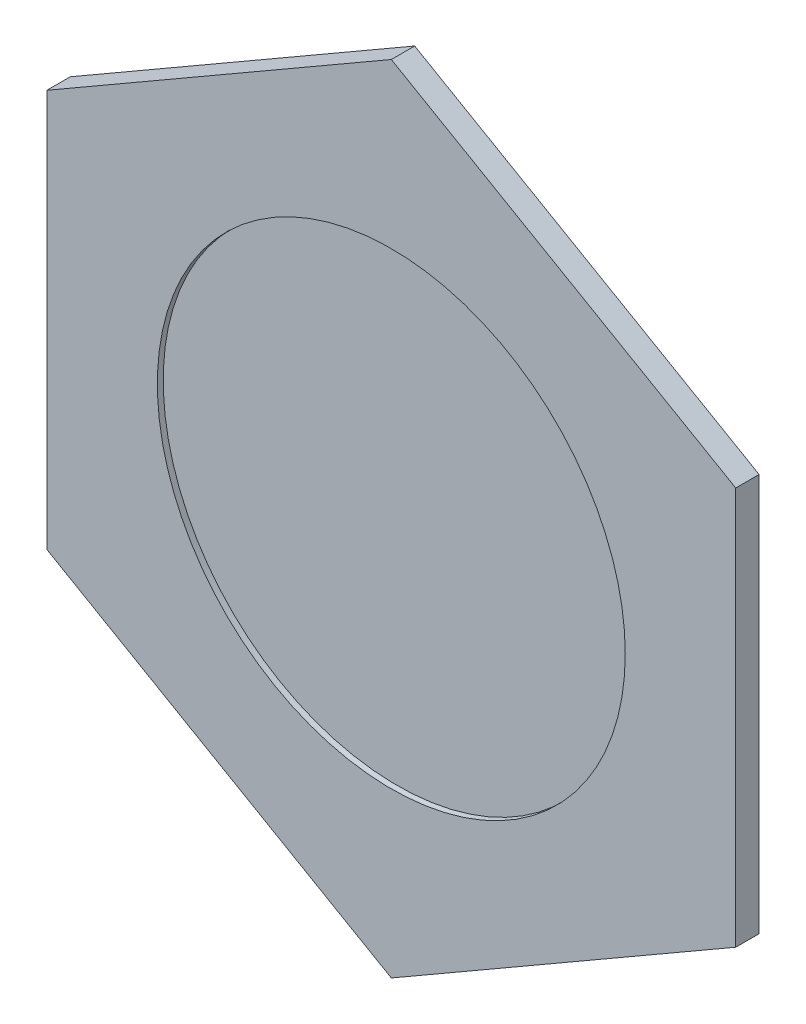
ISO-10303-21;
HEADER;
FILE_DESCRIPTION(('STEP AP214'),'2;1');
FILE_NAME('part.step','',(''),(''),'','','');
FILE_SCHEMA(('AUTOMOTIVE_DESIGN { 1 0 10303 214 1 1 1 1 }'));
ENDSEC;
DATA;
#1=APPLICATION_CONTEXT('core data for automotive mechanical design processes');
#2=APPLICATION_PROTOCOL_DEFINITION('international standard','automotive_design',2000,#1);
#3=PRODUCT_CONTEXT('',#1,'mechanical');
#4=PRODUCT('Part','Part','',(#3));
#5=PRODUCT_RELATED_PRODUCT_CATEGORY('part','',(#4));
#6=PRODUCT_DEFINITION_FORMATION('','',#4);
#7=PRODUCT_DEFINITION_CONTEXT('part definition',#1,'design');
#8=PRODUCT_DEFINITION('design','',#6,#7);
#9=PRODUCT_DEFINITION_SHAPE('','',#8);
#10=(LENGTH_UNIT() NAMED_UNIT(*) SI_UNIT(.MILLI.,.METRE.));
#11=(NAMED_UNIT(*) PLANE_ANGLE_UNIT() SI_UNIT($,.RADIAN.));
#12=(NAMED_UNIT(*) SI_UNIT($,.STERADIAN.) SOLID_ANGLE_UNIT());
#13=UNCERTAINTY_MEASURE_WITH_UNIT(LENGTH_MEASURE(1.E-05),#10,'distance_accuracy_value','');
#14=(GEOMETRIC_REPRESENTATION_CONTEXT(3) GLOBAL_UNCERTAINTY_ASSIGNED_CONTEXT((#13)) GLOBAL_UNIT_ASSIGNED_CONTEXT((#10,
#11,#12)) REPRESENTATION_CONTEXT('',''));
#15=CARTESIAN_POINT('',(0.,0.,0.));
#16=DIRECTION('',(0.,0.,1.));
#17=DIRECTION('',(1.,0.,0.));
#18=AXIS2_PLACEMENT_3D('',#15,#16,#17);
#19=CARTESIAN_POINT('',(0.,68.,4.));
#20=DIRECTION('',(0.5,-0.866025403784439,0.));
#21=DIRECTION('',(0.866025403784439,0.5,0.));
#22=AXIS2_PLACEMENT_3D('',#19,#20,#21);
#23=PLANE('',#22);
#24=DIRECTION('',(-0.866025403784439,-0.5,0.));
#25=VECTOR('',#24,1.);
#26=CARTESIAN_POINT('',(0.,68.,0.));
#27=LINE('',#26,#25);
#28=CARTESIAN_POINT('',(0.,68.,0.));
#29=VERTEX_POINT('',#28);
#30=CARTESIAN_POINT('',(-58.8897274573418,34.,0.));
#31=VERTEX_POINT('',#30);
#32=EDGE_CURVE('E116',#29,#31,#27,.T.);
#33=ORIENTED_EDGE('',*,*,#32,.T.);
#34=DIRECTION('',(0.,0.,-1.));
#35=VECTOR('',#34,1.);
#36=CARTESIAN_POINT('',(-58.8897274573418,34.,4.));
#37=LINE('',#36,#35);
#38=CARTESIAN_POINT('',(-58.8897274573418,34.,4.));
#39=VERTEX_POINT('',#38);
#40=EDGE_CURVE('E11',#39,#31,#37,.T.);
#41=ORIENTED_EDGE('',*,*,#40,.F.);
#42=DIRECTION('',(-0.866025403784439,-0.5,0.));
#43=VECTOR('',#42,1.);
#44=CARTESIAN_POINT('',(0.,68.,4.));
#45=LINE('',#44,#43);
#46=CARTESIAN_POINT('',(0.,68.,4.));
#47=VERTEX_POINT('',#46);
#48=EDGE_CURVE('E127',#47,#39,#45,.T.);
#49=ORIENTED_EDGE('',*,*,#48,.F.);
#50=DIRECTION('',(0.,0.,-1.));
#51=VECTOR('',#50,1.);
#52=CARTESIAN_POINT('',(0.,68.,4.));
#53=LINE('',#52,#51);
#54=EDGE_CURVE('E112',#47,#29,#53,.T.);
#55=ORIENTED_EDGE('',*,*,#54,.T.);
#56=EDGE_LOOP('',(#33,#41,#49,#55));
#57=FACE_BOUND('',#56,.T.);
#58=ADVANCED_FACE('F32',(#57),#23,.F.);
#59=CARTESIAN_POINT('',(-58.8897274573418,34.,4.));
#60=DIRECTION('',(1.,0.,0.));
#61=DIRECTION('',(0.,1.,0.));
#62=AXIS2_PLACEMENT_3D('',#59,#60,#61);
#63=PLANE('',#62);
#64=DIRECTION('',(0.,-1.,0.));
#65=VECTOR('',#64,1.);
#66=CARTESIAN_POINT('',(-58.8897274573418,34.,0.));
#67=LINE('',#66,#65);
#68=CARTESIAN_POINT('',(-58.8897274573418,-34.,0.));
#69=VERTEX_POINT('',#68);
#70=EDGE_CURVE('E119',#31,#69,#67,.T.);
#71=ORIENTED_EDGE('',*,*,#70,.T.);
#72=DIRECTION('',(0.,0.,-1.));
#73=VECTOR('',#72,1.);
#74=CARTESIAN_POINT('',(-58.8897274573418,-34.,4.));
#75=LINE('',#74,#73);
#76=CARTESIAN_POINT('',(-58.8897274573418,-34.,4.));
#77=VERTEX_POINT('',#76);
#78=EDGE_CURVE('E40',#77,#69,#75,.T.);
#79=ORIENTED_EDGE('',*,*,#78,.F.);
#80=DIRECTION('',(0.,-1.,0.));
#81=VECTOR('',#80,1.);
#82=CARTESIAN_POINT('',(-58.8897274573418,34.,4.));
#83=LINE('',#82,#81);
#84=EDGE_CURVE('E85',#39,#77,#83,.T.);
#85=ORIENTED_EDGE('',*,*,#84,.F.);
#86=ORIENTED_EDGE('',*,*,#40,.T.);
#87=EDGE_LOOP('',(#71,#79,#85,#86));
#88=FACE_BOUND('',#87,.T.);
#89=ADVANCED_FACE('F152',(#88),#63,.F.);
#90=CARTESIAN_POINT('',(-58.8897274573418,-34.,4.));
#91=DIRECTION('',(0.5,0.866025403784439,0.));
#92=DIRECTION('',(-0.866025403784439,0.5,0.));
#93=AXIS2_PLACEMENT_3D('',#90,#91,#92);
#94=PLANE('',#93);
#95=DIRECTION('',(0.866025403784439,-0.5,0.));
#96=VECTOR('',#95,1.);
#97=CARTESIAN_POINT('',(-58.8897274573418,-34.,0.));
#98=LINE('',#97,#96);
#99=CARTESIAN_POINT('',(0.,-68.,0.));
#100=VERTEX_POINT('',#99);
#101=EDGE_CURVE('E122',#69,#100,#98,.T.);
#102=ORIENTED_EDGE('',*,*,#101,.T.);
#103=DIRECTION('',(0.,0.,-1.));
#104=VECTOR('',#103,1.);
#105=CARTESIAN_POINT('',(0.,-68.,4.));
#106=LINE('',#105,#104);
#107=CARTESIAN_POINT('',(0.,-68.,4.));
#108=VERTEX_POINT('',#107);
#109=EDGE_CURVE('E107',#108,#100,#106,.T.);
#110=ORIENTED_EDGE('',*,*,#109,.F.);
#111=DIRECTION('',(0.866025403784439,-0.5,0.));
#112=VECTOR('',#111,1.);
#113=CARTESIAN_POINT('',(-58.8897274573418,-34.,4.));
#114=LINE('',#113,#112);
#115=EDGE_CURVE('E98',#77,#108,#114,.T.);
#116=ORIENTED_EDGE('',*,*,#115,.F.);
#117=ORIENTED_EDGE('',*,*,#78,.T.);
#118=EDGE_LOOP('',(#102,#110,#116,#117));
#119=FACE_BOUND('',#118,.T.);
#120=ADVANCED_FACE('F133',(#119),#94,.F.);
#121=CARTESIAN_POINT('',(0.,-68.,4.));
#122=DIRECTION('',(-0.5,0.866025403784439,0.));
#123=DIRECTION('',(-0.866025403784439,-0.5,0.));
#124=AXIS2_PLACEMENT_3D('',#121,#122,#123);
#125=PLANE('',#124);
#126=DIRECTION('',(0.866025403784439,0.5,0.));
#127=VECTOR('',#126,1.);
#128=CARTESIAN_POINT('',(0.,-68.,0.));
#129=LINE('',#128,#127);
#130=CARTESIAN_POINT('',(58.8897274573418,-34.,0.));
#131=VERTEX_POINT('',#130);
#132=EDGE_CURVE('E106',#100,#131,#129,.T.);
#133=ORIENTED_EDGE('',*,*,#132,.T.);
#134=DIRECTION('',(0.,0.,-1.));
#135=VECTOR('',#134,1.);
#136=CARTESIAN_POINT('',(58.8897274573418,-34.,4.));
#137=LINE('',#136,#135);
#138=CARTESIAN_POINT('',(58.8897274573418,-34.,4.));
#139=VERTEX_POINT('',#138);
#140=EDGE_CURVE('E103',#139,#131,#137,.T.);
#141=ORIENTED_EDGE('',*,*,#140,.F.);
#142=DIRECTION('',(0.866025403784439,0.5,0.));
#143=VECTOR('',#142,1.);
#144=CARTESIAN_POINT('',(0.,-68.,4.));
#145=LINE('',#144,#143);
#146=EDGE_CURVE('E92',#108,#139,#145,.T.);
#147=ORIENTED_EDGE('',*,*,#146,.F.);
#148=ORIENTED_EDGE('',*,*,#109,.T.);
#149=EDGE_LOOP('',(#133,#141,#147,#148));
#150=FACE_BOUND('',#149,.T.);
#151=ADVANCED_FACE('F104',(#150),#125,.F.);
#152=CARTESIAN_POINT('',(58.8897274573418,-34.,4.));
#153=DIRECTION('',(-1.,0.,0.));
#154=DIRECTION('',(0.,-1.,0.));
#155=AXIS2_PLACEMENT_3D('',#152,#153,#154);
#156=PLANE('',#155);
#157=DIRECTION('',(0.,1.,0.));
#158=VECTOR('',#157,1.);
#159=CARTESIAN_POINT('',(58.8897274573418,-34.,0.));
#160=LINE('',#159,#158);
#161=CARTESIAN_POINT('',(58.8897274573418,34.,0.));
#162=VERTEX_POINT('',#161);
#163=EDGE_CURVE('E71',#131,#162,#160,.T.);
#164=ORIENTED_EDGE('',*,*,#163,.T.);
#165=DIRECTION('',(0.,0.,-1.));
#166=VECTOR('',#165,1.);
#167=CARTESIAN_POINT('',(58.8897274573418,34.,4.));
#168=LINE('',#167,#166);
#169=CARTESIAN_POINT('',(58.8897274573418,34.,4.));
#170=VERTEX_POINT('',#169);
#171=EDGE_CURVE('E108',#170,#162,#168,.T.);
#172=ORIENTED_EDGE('',*,*,#171,.F.);
#173=DIRECTION('',(0.,1.,0.));
#174=VECTOR('',#173,1.);
#175=CARTESIAN_POINT('',(58.8897274573418,-34.,4.));
#176=LINE('',#175,#174);
#177=EDGE_CURVE('E96',#139,#170,#176,.T.);
#178=ORIENTED_EDGE('',*,*,#177,.F.);
#179=ORIENTED_EDGE('',*,*,#140,.T.);
#180=EDGE_LOOP('',(#164,#172,#178,#179));
#181=FACE_BOUND('',#180,.T.);
#182=ADVANCED_FACE('F110',(#181),#156,.F.);
#183=CARTESIAN_POINT('',(58.8897274573418,34.,4.));
#184=DIRECTION('',(-0.5,-0.866025403784439,0.));
#185=DIRECTION('',(0.866025403784439,-0.5,0.));
#186=AXIS2_PLACEMENT_3D('',#183,#184,#185);
#187=PLANE('',#186);
#188=DIRECTION('',(-0.866025403784439,0.5,0.));
#189=VECTOR('',#188,1.);
#190=CARTESIAN_POINT('',(58.8897274573418,34.,0.));
#191=LINE('',#190,#189);
#192=EDGE_CURVE('E77',#162,#29,#191,.T.);
#193=ORIENTED_EDGE('',*,*,#192,.T.);
#194=ORIENTED_EDGE('',*,*,#54,.F.);
#195=DIRECTION('',(-0.866025403784439,0.5,0.));
#196=VECTOR('',#195,1.);
#197=CARTESIAN_POINT('',(58.8897274573418,34.,4.));
#198=LINE('',#197,#196);
#199=EDGE_CURVE('E48',#170,#47,#198,.T.);
#200=ORIENTED_EDGE('',*,*,#199,.F.);
#201=ORIENTED_EDGE('',*,*,#171,.T.);
#202=EDGE_LOOP('',(#193,#194,#200,#201));
#203=FACE_BOUND('',#202,.T.);
#204=ADVANCED_FACE('F140',(#203),#187,.F.);
#205=CARTESIAN_POINT('',(0.,0.,4.));
#206=DIRECTION('',(0.,0.,1.));
#207=DIRECTION('',(1.,0.,0.));
#208=AXIS2_PLACEMENT_3D('',#205,#206,#207);
#209=PLANE('',#208);
#210=CARTESIAN_POINT('',(0.,0.,4.));
#211=DIRECTION('',(0.,0.,1.));
#212=DIRECTION('',(1.,0.,0.));
#213=AXIS2_PLACEMENT_3D('',#210,#211,#212);
#214=CIRCLE('',#213,40.);
#215=CARTESIAN_POINT('',(40.,0.,4.));
#216=VERTEX_POINT('',#215);
#217=EDGE_CURVE('E213',#216,#216,#214,.T.);
#218=ORIENTED_EDGE('',*,*,#217,.F.);
#219=EDGE_LOOP('',(#218));
#220=FACE_BOUND('',#219,.T.);
#221=ORIENTED_EDGE('',*,*,#48,.T.);
#222=ORIENTED_EDGE('',*,*,#84,.T.);
#223=ORIENTED_EDGE('',*,*,#115,.T.);
#224=ORIENTED_EDGE('',*,*,#146,.T.);
#225=ORIENTED_EDGE('',*,*,#177,.T.);
#226=ORIENTED_EDGE('',*,*,#199,.T.);
#227=EDGE_LOOP('',(#221,#222,#223,#224,#225,#226));
#228=FACE_BOUND('',#227,.T.);
#229=ADVANCED_FACE('F94',(#220,#228),#209,.T.);
#230=CARTESIAN_POINT('',(0.,0.,0.));
#231=DIRECTION('',(0.,0.,1.));
#232=DIRECTION('',(1.,0.,0.));
#233=AXIS2_PLACEMENT_3D('',#230,#231,#232);
#234=PLANE('',#233);
#235=ORIENTED_EDGE('',*,*,#32,.F.);
#236=ORIENTED_EDGE('',*,*,#192,.F.);
#237=ORIENTED_EDGE('',*,*,#163,.F.);
#238=ORIENTED_EDGE('',*,*,#132,.F.);
#239=ORIENTED_EDGE('',*,*,#101,.F.);
#240=ORIENTED_EDGE('',*,*,#70,.F.);
#241=EDGE_LOOP('',(#235,#236,#237,#238,#239,#240));
#242=FACE_BOUND('',#241,.T.);
#243=ADVANCED_FACE('F136',(#242),#234,.F.);
#244=CARTESIAN_POINT('',(0.,0.,3.));
#245=DIRECTION('',(0.,0.,1.));
#246=DIRECTION('',(1.,0.,0.));
#247=AXIS2_PLACEMENT_3D('',#244,#245,#246);
#248=CYLINDRICAL_SURFACE('',#247,40.);
#249=CARTESIAN_POINT('',(0.,0.,3.));
#250=DIRECTION('',(0.,0.,1.));
#251=DIRECTION('',(1.,0.,0.));
#252=AXIS2_PLACEMENT_3D('',#249,#250,#251);
#253=CIRCLE('',#252,40.);
#254=CARTESIAN_POINT('',(40.,0.,3.));
#255=VERTEX_POINT('',#254);
#256=EDGE_CURVE('E120',#255,#255,#253,.T.);
#257=ORIENTED_EDGE('',*,*,#256,.F.);
#258=EDGE_LOOP('',(#257));
#259=FACE_BOUND('',#258,.T.);
#260=ORIENTED_EDGE('',*,*,#217,.T.);
#261=EDGE_LOOP('',(#260));
#262=FACE_BOUND('',#261,.T.);
#263=ADVANCED_FACE('F184',(#259,#262),#248,.F.);
#264=CARTESIAN_POINT('',(0.,0.,3.));
#265=DIRECTION('',(0.,0.,1.));
#266=DIRECTION('',(1.,0.,0.));
#267=AXIS2_PLACEMENT_3D('',#264,#265,#266);
#268=PLANE('',#267);
#269=ORIENTED_EDGE('',*,*,#256,.T.);
#270=EDGE_LOOP('',(#269));
#271=FACE_BOUND('',#270,.T.);
#272=ADVANCED_FACE('F197',(#271),#268,.T.);
#273=CLOSED_SHELL('',(#58,#89,#120,#151,#182,#204,#229,#243,#263,#272));
#274=MANIFOLD_SOLID_BREP('B2',#273);
#275=ADVANCED_BREP_SHAPE_REPRESENTATION('',(#18,#274),#14);
#276=SHAPE_DEFINITION_REPRESENTATION(#9,#275);
ENDSEC;
END-ISO-10303-21;
